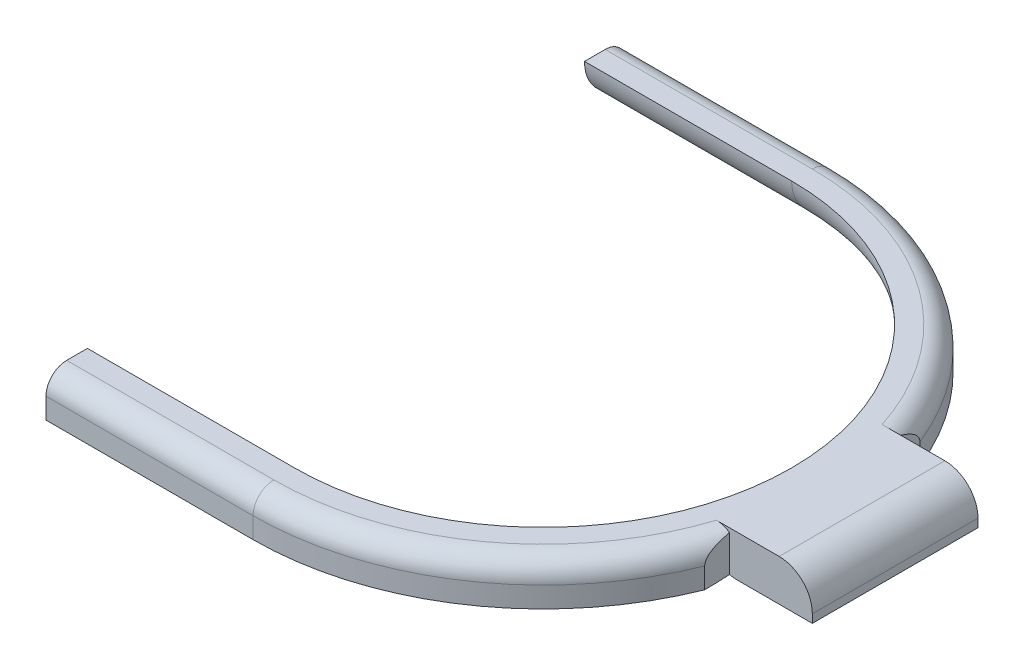
ISO-10303-21;
HEADER;
FILE_DESCRIPTION(('STEP AP214'),'2;1');
FILE_NAME('part.step','',(''),(''),'','','');
FILE_SCHEMA(('AUTOMOTIVE_DESIGN { 1 0 10303 214 1 1 1 1 }'));
ENDSEC;
DATA;
#1=APPLICATION_CONTEXT('core data for automotive mechanical design processes');
#2=APPLICATION_PROTOCOL_DEFINITION('international standard','automotive_design',2000,#1);
#3=PRODUCT_CONTEXT('',#1,'mechanical');
#4=PRODUCT('Part','Part','',(#3));
#5=PRODUCT_RELATED_PRODUCT_CATEGORY('part','',(#4));
#6=PRODUCT_DEFINITION_FORMATION('','',#4);
#7=PRODUCT_DEFINITION_CONTEXT('part definition',#1,'design');
#8=PRODUCT_DEFINITION('design','',#6,#7);
#9=PRODUCT_DEFINITION_SHAPE('','',#8);
#10=(LENGTH_UNIT() NAMED_UNIT(*) SI_UNIT(.MILLI.,.METRE.));
#11=(NAMED_UNIT(*) PLANE_ANGLE_UNIT() SI_UNIT($,.RADIAN.));
#12=(NAMED_UNIT(*) SI_UNIT($,.STERADIAN.) SOLID_ANGLE_UNIT());
#13=UNCERTAINTY_MEASURE_WITH_UNIT(LENGTH_MEASURE(1.E-05),#10,'distance_accuracy_value','');
#14=(GEOMETRIC_REPRESENTATION_CONTEXT(3) GLOBAL_UNCERTAINTY_ASSIGNED_CONTEXT((#13)) GLOBAL_UNIT_ASSIGNED_CONTEXT((#10,
#11,#12)) REPRESENTATION_CONTEXT('',''));
#15=CARTESIAN_POINT('',(0.,0.,0.));
#16=DIRECTION('',(0.,0.,1.));
#17=DIRECTION('',(1.,0.,0.));
#18=AXIS2_PLACEMENT_3D('',#15,#16,#17);
#19=CARTESIAN_POINT('',(16.51,0.,0.));
#20=DIRECTION('',(-1.,0.,0.));
#21=DIRECTION('',(0.,0.,1.));
#22=AXIS2_PLACEMENT_3D('',#19,#20,#21);
#23=PLANE('',#22);
#24=DIRECTION('',(0.,-1.,0.));
#25=VECTOR('',#24,1.);
#26=CARTESIAN_POINT('',(16.51,2.54,-21.8391135768376));
#27=LINE('',#26,#25);
#28=CARTESIAN_POINT('',(16.51,0.,-21.8391135768376));
#29=VERTEX_POINT('',#28);
#30=CARTESIAN_POINT('',(16.51,1.27,-21.8391135768376));
#31=VERTEX_POINT('',#30);
#32=EDGE_CURVE('E324',#29,#31,#27,.F.);
#33=ORIENTED_EDGE('',*,*,#32,.T.);
#34=CARTESIAN_POINT('',(16.51,1.27,-21.8391135768376));
#35=CARTESIAN_POINT('',(16.51,1.29957192329558,-21.8391956993707));
#36=CARTESIAN_POINT('',(16.51,1.32903464210065,-21.8363349804039));
#37=CARTESIAN_POINT('',(16.51,1.38665030756244,-21.8254939918044));
#38=CARTESIAN_POINT('',(16.51,1.4148147761307,-21.817575977312));
#39=CARTESIAN_POINT('',(16.51,1.47586722255378,-21.794996555653));
#40=CARTESIAN_POINT('',(16.51,1.50832522730156,-21.7791932435904));
#41=CARTESIAN_POINT('',(16.51,1.57037414609046,-21.7425488724249));
#42=CARTESIAN_POINT('',(16.51,1.59995005333794,-21.7216832340086));
#43=CARTESIAN_POINT('',(16.51,1.6734640906306,-21.6624048809831));
#44=CARTESIAN_POINT('',(16.51,1.71504003057241,-21.6210957966083));
#45=CARTESIAN_POINT('',(16.51,1.79176285085238,-21.5329752369118));
#46=CARTESIAN_POINT('',(16.51,1.82689530363604,-21.4861517899741));
#47=CARTESIAN_POINT('',(16.51,1.8930377783374,-21.3875264120823));
#48=CARTESIAN_POINT('',(16.51,1.9238784461257,-21.3356126654981));
#49=CARTESIAN_POINT('',(16.51,1.98116795391221,-21.2293874674086));
#50=CARTESIAN_POINT('',(16.51,2.00761187298022,-21.1750734143188));
#51=CARTESIAN_POINT('',(16.51,2.05695635495535,-21.0647063126304));
#52=CARTESIAN_POINT('',(16.51,2.07984742725165,-21.0086490706289));
#53=CARTESIAN_POINT('',(16.51,2.12262000600726,-20.8953918875263));
#54=CARTESIAN_POINT('',(16.51,2.14250064768643,-20.8381916234005));
#55=CARTESIAN_POINT('',(16.51,2.18566855710963,-20.7045945971293));
#56=CARTESIAN_POINT('',(16.51,2.20801801972574,-20.6278976026139));
#57=CARTESIAN_POINT('',(16.51,2.24889350988818,-20.4742166986682));
#58=CARTESIAN_POINT('',(16.51,2.26745184212038,-20.3972414403506));
#59=CARTESIAN_POINT('',(16.51,2.28459665484587,-20.32));
#60=B_SPLINE_CURVE_WITH_KNOTS('',3,(#34,#35,#36,#37,#38,#39,#40,#41,#42,#43,#44,#45,#46,#47,#48,
#49,#50,#51,#52,#53,#54,#55,#56,#57,#58,#59),.UNSPECIFIED.,.F.,.F.,(4,2,2,2,2,2,2,2,2,2,2,2,4),
(0.,0.0884016339942781,0.175735486757691,0.283434021950953,0.391666319888252,0.566503784031838,
0.741728069174911,0.92259965587675,1.10367233455243,1.28522067745047,1.46682107362519,
1.70638026977833,1.9438041429385),.UNSPECIFIED.);
#61=CARTESIAN_POINT('',(16.51,2.28459665484588,-20.32));
#62=VERTEX_POINT('',#61);
#63=EDGE_CURVE('E247',#31,#62,#60,.T.);
#64=ORIENTED_EDGE('',*,*,#63,.T.);
#65=DIRECTION('',(0.,1.,0.));
#66=VECTOR('',#65,1.);
#67=CARTESIAN_POINT('',(16.51,0.,-20.32));
#68=LINE('',#67,#66);
#69=CARTESIAN_POINT('',(16.51,0.0509379398851836,-20.32));
#70=VERTEX_POINT('',#69);
#71=EDGE_CURVE('E182',#70,#62,#68,.T.);
#72=ORIENTED_EDGE('',*,*,#71,.F.);
#73=CARTESIAN_POINT('',(16.51,0.0509379398851836,-20.32));
#74=CARTESIAN_POINT('',(16.51,0.0433773737680133,-20.4464635100683));
#75=CARTESIAN_POINT('',(16.51,0.0364205547009695,-20.5729670385125));
#76=CARTESIAN_POINT('',(16.51,0.0240503931053028,-20.8260206146187));
#77=CARTESIAN_POINT('',(16.51,0.0186367071416438,-20.9525706456437));
#78=CARTESIAN_POINT('',(16.51,0.00968477527614573,-21.2057500320715));
#79=CARTESIAN_POINT('',(16.51,0.00614667731656588,-21.3323793929432));
#80=CARTESIAN_POINT('',(16.51,0.00130588216209494,-21.5857080243475));
#81=CARTESIAN_POINT('',(16.51,3.68359901411543E-06,-21.7124073041727));
#82=CARTESIAN_POINT('',(16.51,0.,-21.8391135768376));
#83=B_SPLINE_CURVE_WITH_KNOTS('',3,(#73,#74,#75,#76,#77,#78,#79,#80,#81,#82),.UNSPECIFIED.,.F.,
.F.,(4,2,2,2,4),(0.,0.380072205109549,0.760059756335925,1.14007727568707,1.52017953240358),.UNSPECIFIED.);
#84=EDGE_CURVE('E200',#70,#29,#83,.T.);
#85=ORIENTED_EDGE('',*,*,#84,.T.);
#86=EDGE_LOOP('',(#33,#64,#72,#85));
#87=FACE_BOUND('',#86,.T.);
#88=ADVANCED_FACE('F33',(#87),#23,.F.);
#89=DIRECTION('',(0.,-1.,0.));
#90=VECTOR('',#89,1.);
#91=CARTESIAN_POINT('',(16.51,0.,-10.16));
#92=LINE('',#91,#90);
#93=CARTESIAN_POINT('',(16.51,2.28459665484588,-10.16));
#94=VERTEX_POINT('',#93);
#95=CARTESIAN_POINT('',(16.51,0.0509379398851836,-10.16));
#96=VERTEX_POINT('',#95);
#97=EDGE_CURVE('E186',#94,#96,#92,.T.);
#98=ORIENTED_EDGE('',*,*,#97,.F.);
#99=CARTESIAN_POINT('',(16.51,2.28459665484588,-10.16));
#100=CARTESIAN_POINT('',(16.51,2.26660719846655,-10.0789821772811));
#101=CARTESIAN_POINT('',(16.51,2.24707025721331,-9.99825408169174));
#102=CARTESIAN_POINT('',(16.51,2.20391715925547,-9.83747964380927));
#103=CARTESIAN_POINT('',(16.51,2.18028147710955,-9.75743858280148));
#104=CARTESIAN_POINT('',(16.51,2.12779802247256,-9.59801014376653));
#105=CARTESIAN_POINT('',(16.51,2.09889208131413,-9.51864160065115));
#106=CARTESIAN_POINT('',(16.51,2.03472968285877,-9.36262990430201));
#107=CARTESIAN_POINT('',(16.51,1.9994872958267,-9.28598115431515));
#108=CARTESIAN_POINT('',(16.51,1.93573378047491,-9.16570434447224));
#109=CARTESIAN_POINT('',(16.51,1.90983535881678,-9.12069968544181));
#110=CARTESIAN_POINT('',(16.51,1.85413233618648,-9.03310021345614));
#111=CARTESIAN_POINT('',(16.51,1.82432601653496,-8.99050647268378));
#112=CARTESIAN_POINT('',(16.51,1.75963352899151,-8.90854199204505));
#113=CARTESIAN_POINT('',(16.51,1.72469541483683,-8.86921155333711));
#114=CARTESIAN_POINT('',(16.51,1.64901143803038,-8.79654540444889));
#115=CARTESIAN_POINT('',(16.51,1.60828455679736,-8.76319087688441));
#116=CARTESIAN_POINT('',(16.51,1.53869952734225,-8.7179640249935));
#117=CARTESIAN_POINT('',(16.51,1.51191776025871,-8.70291760399087));
#118=CARTESIAN_POINT('',(16.51,1.45638304554998,-8.67716555632066));
#119=CARTESIAN_POINT('',(16.51,1.42763655899632,-8.66644643301098));
#120=CARTESIAN_POINT('',(16.51,1.37736548918517,-8.65267883909492));
#121=CARTESIAN_POINT('',(16.51,1.35620319159293,-8.64830160266421));
#122=CARTESIAN_POINT('',(16.51,1.3133720501847,-8.64238443866641));
#123=CARTESIAN_POINT('',(16.51,1.29170107931136,-8.64086005174927));
#124=CARTESIAN_POINT('',(16.51,1.27,-8.64088642316235));
#125=B_SPLINE_CURVE_WITH_KNOTS('',3,(#99,#100,#101,#102,#103,#104,#105,#106,#107,#108,#109,#110,
#111,#112,#113,#114,#115,#116,#117,#118,#119,#120,#121,#122,#123,#124),.UNSPECIFIED.,.F.,.F.,(4,
2,2,2,2,2,2,2,2,2,2,2,4),(0.,0.249038643903638,0.499297985054032,0.752508076254614,
1.00516269918887,1.16078790119703,1.31648177764216,1.47387683724518,1.63076721867043,
1.7226360306251,1.81421605215406,1.87886403888139,1.94386317623388),.UNSPECIFIED.);
#126=CARTESIAN_POINT('',(16.51,1.27,-8.64088642316235));
#127=VERTEX_POINT('',#126);
#128=EDGE_CURVE('E270',#94,#127,#125,.T.);
#129=ORIENTED_EDGE('',*,*,#128,.T.);
#130=DIRECTION('',(0.,-1.,0.));
#131=VECTOR('',#130,1.);
#132=CARTESIAN_POINT('',(16.51,2.54,-8.64088642316235));
#133=LINE('',#132,#131);
#134=CARTESIAN_POINT('',(16.51,0.,-8.64088642316235));
#135=VERTEX_POINT('',#134);
#136=EDGE_CURVE('E323',#127,#135,#133,.T.);
#137=ORIENTED_EDGE('',*,*,#136,.T.);
#138=CARTESIAN_POINT('',(16.51,0.,-8.64088642316235));
#139=CARTESIAN_POINT('',(16.51,3.68359901443557E-06,-8.76759269582731));
#140=CARTESIAN_POINT('',(16.51,0.00130588216209523,-8.89429197565246));
#141=CARTESIAN_POINT('',(16.51,0.00614667731656587,-9.14762060705681));
#142=CARTESIAN_POINT('',(16.51,0.00968477527614546,-9.27424996792849));
#143=CARTESIAN_POINT('',(16.51,0.0186367071416434,-9.52742935435629));
#144=CARTESIAN_POINT('',(16.51,0.0240503931053024,-9.65397938538129));
#145=CARTESIAN_POINT('',(16.51,0.0364205547009694,-9.90703296148751));
#146=CARTESIAN_POINT('',(16.51,0.0433773737680132,-10.0335364899317));
#147=CARTESIAN_POINT('',(16.51,0.0509379398851837,-10.16));
#148=B_SPLINE_CURVE_WITH_KNOTS('',3,(#138,#139,#140,#141,#142,#143,#144,#145,#146,#147),
.UNSPECIFIED.,.F.,.F.,(4,2,2,2,4),(0.,0.380102256716508,0.760119776067651,1.14010732729403,
1.52017953240358),.UNSPECIFIED.);
#149=EDGE_CURVE('E273',#135,#96,#148,.T.);
#150=ORIENTED_EDGE('',*,*,#149,.T.);
#151=EDGE_LOOP('',(#98,#129,#137,#150));
#152=FACE_BOUND('',#151,.T.);
#153=ADVANCED_FACE('F269',(#152),#23,.F.);
#154=CARTESIAN_POINT('',(0.,2.54,-15.24));
#155=DIRECTION('',(0.,-1.,0.));
#156=DIRECTION('',(0.,0.,-1.));
#157=AXIS2_PLACEMENT_3D('',#154,#155,#156);
#158=CYLINDRICAL_SURFACE('',#157,17.78);
#159=DIRECTION('',(0.,-1.,0.));
#160=VECTOR('',#159,1.);
#161=CARTESIAN_POINT('',(2.00491150009512E-13,2.54,-33.02));
#162=LINE('',#161,#160);
#163=CARTESIAN_POINT('',(2.00491150009512E-13,1.27,-33.02));
#164=VERTEX_POINT('',#163);
#165=CARTESIAN_POINT('',(2.00491150009512E-13,0.,-33.02));
#166=VERTEX_POINT('',#165);
#167=EDGE_CURVE('E353',#164,#166,#162,.T.);
#168=ORIENTED_EDGE('',*,*,#167,.F.);
#169=CARTESIAN_POINT('',(0.,1.27,-15.24));
#170=DIRECTION('',(0.,1.,0.));
#171=DIRECTION('',(0.,0.,1.));
#172=AXIS2_PLACEMENT_3D('',#169,#170,#171);
#173=CIRCLE('',#172,17.78);
#174=EDGE_CURVE('E254',#164,#31,#173,.F.);
#175=ORIENTED_EDGE('',*,*,#174,.T.);
#176=ORIENTED_EDGE('',*,*,#32,.F.);
#177=CARTESIAN_POINT('',(0.,0.,-15.24));
#178=DIRECTION('',(0.,1.,0.));
#179=DIRECTION('',(1.,0.,0.));
#180=AXIS2_PLACEMENT_3D('',#177,#178,#179);
#181=CIRCLE('',#180,17.78);
#182=EDGE_CURVE('E348',#166,#29,#181,.F.);
#183=ORIENTED_EDGE('',*,*,#182,.F.);
#184=EDGE_LOOP('',(#168,#175,#176,#183));
#185=FACE_BOUND('',#184,.T.);
#186=ADVANCED_FACE('F403',(#185),#158,.T.);
#187=CARTESIAN_POINT('',(-12.6999999999997,2.54,2.54));
#188=DIRECTION('',(-1.,0.,0.));
#189=DIRECTION('',(0.,0.,1.));
#190=AXIS2_PLACEMENT_3D('',#187,#188,#189);
#191=PLANE('',#190);
#192=DIRECTION('',(0.,-1.,0.));
#193=VECTOR('',#192,1.);
#194=CARTESIAN_POINT('',(-12.6999999999997,2.54,2.54));
#195=LINE('',#194,#193);
#196=CARTESIAN_POINT('',(-12.6999999999997,1.27,2.54));
#197=VERTEX_POINT('',#196);
#198=CARTESIAN_POINT('',(-12.6999999999997,0.,2.54));
#199=VERTEX_POINT('',#198);
#200=EDGE_CURVE('E357',#197,#199,#195,.T.);
#201=ORIENTED_EDGE('',*,*,#200,.F.);
#202=CARTESIAN_POINT('',(-12.6999999999997,1.27,1.27));
#203=DIRECTION('',(-1.,0.,0.));
#204=DIRECTION('',(0.,0.,1.));
#205=AXIS2_PLACEMENT_3D('',#202,#203,#204);
#206=CIRCLE('',#205,1.27);
#207=CARTESIAN_POINT('',(-12.6999999999997,2.54,1.27));
#208=VERTEX_POINT('',#207);
#209=EDGE_CURVE('E256',#197,#208,#206,.T.);
#210=ORIENTED_EDGE('',*,*,#209,.T.);
#211=DIRECTION('',(0.,0.,-1.));
#212=VECTOR('',#211,1.);
#213=CARTESIAN_POINT('',(-12.6999999999997,2.54,2.54));
#214=LINE('',#213,#212);
#215=CARTESIAN_POINT('',(-12.6999999999997,2.54,0.));
#216=VERTEX_POINT('',#215);
#217=EDGE_CURVE('E333',#208,#216,#214,.T.);
#218=ORIENTED_EDGE('',*,*,#217,.T.);
#219=CARTESIAN_POINT('',(-12.6999999999997,2.54,2.54));
#220=DIRECTION('',(-1.,0.,0.));
#221=DIRECTION('',(0.,0.,1.));
#222=AXIS2_PLACEMENT_3D('',#219,#220,#221);
#223=CIRCLE('',#222,2.54);
#224=EDGE_CURVE('E364',#216,#199,#223,.T.);
#225=ORIENTED_EDGE('',*,*,#224,.T.);
#226=EDGE_LOOP('',(#201,#210,#218,#225));
#227=FACE_BOUND('',#226,.T.);
#228=ADVANCED_FACE('F372',(#227),#191,.T.);
#229=CARTESIAN_POINT('',(0.,2.54,2.54));
#230=DIRECTION('',(0.,0.,1.));
#231=DIRECTION('',(1.,0.,0.));
#232=AXIS2_PLACEMENT_3D('',#229,#230,#231);
#233=PLANE('',#232);
#234=DIRECTION('',(0.,-1.,0.));
#235=VECTOR('',#234,1.);
#236=CARTESIAN_POINT('',(0.,2.54,2.54));
#237=LINE('',#236,#235);
#238=CARTESIAN_POINT('',(0.,1.27,2.54));
#239=VERTEX_POINT('',#238);
#240=CARTESIAN_POINT('',(0.,0.,2.54));
#241=VERTEX_POINT('',#240);
#242=EDGE_CURVE('E355',#239,#241,#237,.T.);
#243=ORIENTED_EDGE('',*,*,#242,.F.);
#244=DIRECTION('',(-1.,0.,0.));
#245=VECTOR('',#244,1.);
#246=CARTESIAN_POINT('',(0.,1.27,2.54));
#247=LINE('',#246,#245);
#248=EDGE_CURVE('E253',#239,#197,#247,.T.);
#249=ORIENTED_EDGE('',*,*,#248,.T.);
#250=ORIENTED_EDGE('',*,*,#200,.T.);
#251=DIRECTION('',(1.,0.,0.));
#252=VECTOR('',#251,1.);
#253=CARTESIAN_POINT('',(0.,0.,2.54));
#254=LINE('',#253,#252);
#255=EDGE_CURVE('E327',#241,#199,#254,.F.);
#256=ORIENTED_EDGE('',*,*,#255,.F.);
#257=EDGE_LOOP('',(#243,#249,#250,#256));
#258=FACE_BOUND('',#257,.T.);
#259=ADVANCED_FACE('F379',(#258),#233,.T.);
#260=ORIENTED_EDGE('',*,*,#136,.F.);
#261=CARTESIAN_POINT('',(0.,1.27,-15.24));
#262=DIRECTION('',(0.,1.,0.));
#263=DIRECTION('',(0.,0.,1.));
#264=AXIS2_PLACEMENT_3D('',#261,#262,#263);
#265=CIRCLE('',#264,17.78);
#266=EDGE_CURVE('E277',#127,#239,#265,.F.);
#267=ORIENTED_EDGE('',*,*,#266,.T.);
#268=ORIENTED_EDGE('',*,*,#242,.T.);
#269=EDGE_CURVE('E347',#135,#241,#181,.F.);
#270=ORIENTED_EDGE('',*,*,#269,.F.);
#271=EDGE_LOOP('',(#260,#267,#268,#270));
#272=FACE_BOUND('',#271,.T.);
#273=ADVANCED_FACE('F381',(#272),#158,.T.);
#274=CARTESIAN_POINT('',(-12.6999999999998,2.54,-33.02));
#275=DIRECTION('',(0.,0.,-1.));
#276=DIRECTION('',(-1.,0.,0.));
#277=AXIS2_PLACEMENT_3D('',#274,#275,#276);
#278=PLANE('',#277);
#279=DIRECTION('',(0.,-1.,0.));
#280=VECTOR('',#279,1.);
#281=CARTESIAN_POINT('',(-12.6999999999998,2.54,-33.02));
#282=LINE('',#281,#280);
#283=CARTESIAN_POINT('',(-12.6999999999998,1.27,-33.02));
#284=VERTEX_POINT('',#283);
#285=CARTESIAN_POINT('',(-12.6999999999998,0.,-33.02));
#286=VERTEX_POINT('',#285);
#287=EDGE_CURVE('E344',#284,#286,#282,.T.);
#288=ORIENTED_EDGE('',*,*,#287,.F.);
#289=DIRECTION('',(1.,0.,0.));
#290=VECTOR('',#289,1.);
#291=CARTESIAN_POINT('',(-12.6999999999998,1.27,-33.02));
#292=LINE('',#291,#290);
#293=EDGE_CURVE('E293',#284,#164,#292,.T.);
#294=ORIENTED_EDGE('',*,*,#293,.T.);
#295=ORIENTED_EDGE('',*,*,#167,.T.);
#296=DIRECTION('',(1.,0.,0.));
#297=VECTOR('',#296,1.);
#298=CARTESIAN_POINT('',(-12.6999999999998,0.,-33.02));
#299=LINE('',#298,#297);
#300=EDGE_CURVE('E334',#286,#166,#299,.T.);
#301=ORIENTED_EDGE('',*,*,#300,.F.);
#302=EDGE_LOOP('',(#288,#294,#295,#301));
#303=FACE_BOUND('',#302,.T.);
#304=ADVANCED_FACE('F417',(#303),#278,.T.);
#305=CARTESIAN_POINT('',(-12.6999999999998,2.54,-30.48));
#306=DIRECTION('',(-1.,0.,0.));
#307=DIRECTION('',(0.,0.,1.));
#308=AXIS2_PLACEMENT_3D('',#305,#306,#307);
#309=PLANE('',#308);
#310=DIRECTION('',(0.,0.,-1.));
#311=VECTOR('',#310,1.);
#312=CARTESIAN_POINT('',(-12.6999999999998,2.54,-30.48));
#313=LINE('',#312,#311);
#314=CARTESIAN_POINT('',(-12.6999999999998,2.54,-30.48));
#315=VERTEX_POINT('',#314);
#316=CARTESIAN_POINT('',(-12.6999999999998,2.54,-31.75));
#317=VERTEX_POINT('',#316);
#318=EDGE_CURVE('E336',#315,#317,#313,.T.);
#319=ORIENTED_EDGE('',*,*,#318,.T.);
#320=CARTESIAN_POINT('',(-12.6999999999998,1.27,-31.75));
#321=DIRECTION('',(-1.,0.,0.));
#322=DIRECTION('',(0.,0.,1.));
#323=AXIS2_PLACEMENT_3D('',#320,#321,#322);
#324=CIRCLE('',#323,1.27);
#325=EDGE_CURVE('E278',#317,#284,#324,.T.);
#326=ORIENTED_EDGE('',*,*,#325,.T.);
#327=ORIENTED_EDGE('',*,*,#287,.T.);
#328=CARTESIAN_POINT('',(-12.6999999999998,2.54,-33.02));
#329=DIRECTION('',(-1.,0.,0.));
#330=DIRECTION('',(0.,0.,1.));
#331=AXIS2_PLACEMENT_3D('',#328,#329,#330);
#332=CIRCLE('',#331,2.54);
#333=EDGE_CURVE('E362',#286,#315,#332,.T.);
#334=ORIENTED_EDGE('',*,*,#333,.T.);
#335=EDGE_LOOP('',(#319,#326,#327,#334));
#336=FACE_BOUND('',#335,.T.);
#337=ADVANCED_FACE('F422',(#336),#309,.T.);
#338=CARTESIAN_POINT('',(0.,2.54,-15.24));
#339=DIRECTION('',(0.,1.,0.));
#340=DIRECTION('',(1.,0.,0.));
#341=AXIS2_PLACEMENT_3D('',#338,#339,#340);
#342=PLANE('',#341);
#343=DIRECTION('',(-1.,0.,0.));
#344=VECTOR('',#343,1.);
#345=CARTESIAN_POINT('',(21.59,2.54,-10.16));
#346=LINE('',#345,#344);
#347=CARTESIAN_POINT('',(19.558,2.54,-10.16));
#348=VERTEX_POINT('',#347);
#349=CARTESIAN_POINT('',(15.7090324336034,2.54,-10.16));
#350=VERTEX_POINT('',#349);
#351=EDGE_CURVE('E167',#348,#350,#346,.T.);
#352=ORIENTED_EDGE('',*,*,#351,.F.);
#353=DIRECTION('',(0.,0.,1.));
#354=VECTOR('',#353,1.);
#355=CARTESIAN_POINT('',(19.558,2.54,-15.24));
#356=LINE('',#355,#354);
#357=CARTESIAN_POINT('',(19.558,2.54,-20.32));
#358=VERTEX_POINT('',#357);
#359=EDGE_CURVE('E41',#348,#358,#356,.F.);
#360=ORIENTED_EDGE('',*,*,#359,.T.);
#361=DIRECTION('',(-1.,0.,0.));
#362=VECTOR('',#361,1.);
#363=CARTESIAN_POINT('',(21.59,2.54,-20.32));
#364=LINE('',#363,#362);
#365=CARTESIAN_POINT('',(15.7090324336034,2.54,-20.32));
#366=VERTEX_POINT('',#365);
#367=EDGE_CURVE('E315',#358,#366,#364,.T.);
#368=ORIENTED_EDGE('',*,*,#367,.T.);
#369=CARTESIAN_POINT('',(0.,2.54,-15.24));
#370=DIRECTION('',(0.,1.,0.));
#371=DIRECTION('',(0.,0.,1.));
#372=AXIS2_PLACEMENT_3D('',#369,#370,#371);
#373=CIRCLE('',#372,16.51);
#374=CARTESIAN_POINT('',(2.00491150009512E-13,2.54,-31.75));
#375=VERTEX_POINT('',#374);
#376=EDGE_CURVE('E287',#366,#375,#373,.T.);
#377=ORIENTED_EDGE('',*,*,#376,.T.);
#378=DIRECTION('',(1.,0.,0.));
#379=VECTOR('',#378,1.);
#380=CARTESIAN_POINT('',(0.,2.54,-31.75));
#381=LINE('',#380,#379);
#382=EDGE_CURVE('E285',#375,#317,#381,.F.);
#383=ORIENTED_EDGE('',*,*,#382,.T.);
#384=ORIENTED_EDGE('',*,*,#318,.F.);
#385=DIRECTION('',(1.,0.,0.));
#386=VECTOR('',#385,1.);
#387=CARTESIAN_POINT('',(-12.6999999999998,2.54,-30.48));
#388=LINE('',#387,#386);
#389=CARTESIAN_POINT('',(1.85615411929518E-13,2.54,-30.48));
#390=VERTEX_POINT('',#389);
#391=EDGE_CURVE('E339',#315,#390,#388,.T.);
#392=ORIENTED_EDGE('',*,*,#391,.T.);
#393=CARTESIAN_POINT('',(0.,2.54,-15.24));
#394=DIRECTION('',(0.,-1.,0.));
#395=DIRECTION('',(0.,0.,-1.));
#396=AXIS2_PLACEMENT_3D('',#393,#394,#395);
#397=CIRCLE('',#396,15.24);
#398=CARTESIAN_POINT('',(0.,2.54,0.));
#399=VERTEX_POINT('',#398);
#400=EDGE_CURVE('E342',#390,#399,#397,.T.);
#401=ORIENTED_EDGE('',*,*,#400,.T.);
#402=DIRECTION('',(-1.,0.,0.));
#403=VECTOR('',#402,1.);
#404=CARTESIAN_POINT('',(0.,2.54,0.));
#405=LINE('',#404,#403);
#406=EDGE_CURVE('E330',#399,#216,#405,.T.);
#407=ORIENTED_EDGE('',*,*,#406,.T.);
#408=ORIENTED_EDGE('',*,*,#217,.F.);
#409=DIRECTION('',(-1.,0.,0.));
#410=VECTOR('',#409,1.);
#411=CARTESIAN_POINT('',(0.,2.54,1.27));
#412=LINE('',#411,#410);
#413=CARTESIAN_POINT('',(0.,2.54,1.27));
#414=VERTEX_POINT('',#413);
#415=EDGE_CURVE('E291',#208,#414,#412,.F.);
#416=ORIENTED_EDGE('',*,*,#415,.T.);
#417=CARTESIAN_POINT('',(0.,2.54,-15.24));
#418=DIRECTION('',(0.,1.,0.));
#419=DIRECTION('',(0.,0.,1.));
#420=AXIS2_PLACEMENT_3D('',#417,#418,#419);
#421=CIRCLE('',#420,16.51);
#422=EDGE_CURVE('E289',#414,#350,#421,.T.);
#423=ORIENTED_EDGE('',*,*,#422,.T.);
#424=EDGE_LOOP('',(#352,#360,#368,#377,#383,#384,#392,#401,#407,#408,#416,#423));
#425=FACE_BOUND('',#424,.T.);
#426=ADVANCED_FACE('F435',(#425),#342,.T.);
#427=CARTESIAN_POINT('',(0.,0.,-15.24));
#428=DIRECTION('',(0.,1.,0.));
#429=DIRECTION('',(1.,0.,0.));
#430=AXIS2_PLACEMENT_3D('',#427,#428,#429);
#431=PLANE('',#430);
#432=DIRECTION('',(-1.,0.,0.));
#433=VECTOR('',#432,1.);
#434=CARTESIAN_POINT('',(21.59,0.,-10.16));
#435=LINE('',#434,#433);
#436=CARTESIAN_POINT('',(21.59,0.,-10.16));
#437=VERTEX_POINT('',#436);
#438=CARTESIAN_POINT('',(17.0388379885485,0.,-10.16));
#439=VERTEX_POINT('',#438);
#440=EDGE_CURVE('E161',#437,#439,#435,.T.);
#441=ORIENTED_EDGE('',*,*,#440,.T.);
#442=CARTESIAN_POINT('',(0.,0.,-15.24));
#443=DIRECTION('',(0.,1.,0.));
#444=DIRECTION('',(0.,0.,1.));
#445=AXIS2_PLACEMENT_3D('',#442,#443,#444);
#446=CIRCLE('',#445,17.78);
#447=CARTESIAN_POINT('',(17.0388379885485,0.,-20.32));
#448=VERTEX_POINT('',#447);
#449=EDGE_CURVE('E358',#439,#448,#446,.T.);
#450=ORIENTED_EDGE('',*,*,#449,.T.);
#451=DIRECTION('',(-1.,0.,0.));
#452=VECTOR('',#451,1.);
#453=CARTESIAN_POINT('',(21.59,0.,-20.32));
#454=LINE('',#453,#452);
#455=CARTESIAN_POINT('',(21.59,0.,-20.32));
#456=VERTEX_POINT('',#455);
#457=EDGE_CURVE('E168',#456,#448,#454,.T.);
#458=ORIENTED_EDGE('',*,*,#457,.F.);
#459=DIRECTION('',(0.,0.,-1.));
#460=VECTOR('',#459,1.);
#461=CARTESIAN_POINT('',(21.59,0.,-20.32));
#462=LINE('',#461,#460);
#463=EDGE_CURVE('E154',#437,#456,#462,.T.);
#464=ORIENTED_EDGE('',*,*,#463,.F.);
#465=EDGE_LOOP('',(#441,#450,#458,#464));
#466=FACE_BOUND('',#465,.T.);
#467=ADVANCED_FACE('F170',(#466),#431,.F.);
#468=CARTESIAN_POINT('',(21.59,0.,-20.32));
#469=DIRECTION('',(0.,0.,1.));
#470=DIRECTION('',(1.,0.,0.));
#471=AXIS2_PLACEMENT_3D('',#468,#469,#470);
#472=PLANE('',#471);
#473=ORIENTED_EDGE('',*,*,#367,.F.);
#474=CARTESIAN_POINT('',(19.558,0.508,-20.32));
#475=DIRECTION('',(0.,0.,1.));
#476=DIRECTION('',(1.,0.,0.));
#477=AXIS2_PLACEMENT_3D('',#474,#475,#476);
#478=CIRCLE('',#477,2.032);
#479=CARTESIAN_POINT('',(21.59,0.508,-20.32));
#480=VERTEX_POINT('',#479);
#481=EDGE_CURVE('E11',#358,#480,#478,.F.);
#482=ORIENTED_EDGE('',*,*,#481,.T.);
#483=DIRECTION('',(0.,1.,0.));
#484=VECTOR('',#483,1.);
#485=CARTESIAN_POINT('',(21.59,0.,-20.32));
#486=LINE('',#485,#484);
#487=EDGE_CURVE('E158',#456,#480,#486,.T.);
#488=ORIENTED_EDGE('',*,*,#487,.F.);
#489=ORIENTED_EDGE('',*,*,#457,.T.);
#490=CARTESIAN_POINT('',(17.0388379885485,0.,-20.32));
#491=CARTESIAN_POINT('',(16.9498827669766,2.53908682923645E-05,-20.32));
#492=CARTESIAN_POINT('',(16.8613351897019,0.00428294066348747,-20.32));
#493=CARTESIAN_POINT('',(16.6850558651941,0.0212623059550475,-20.32));
#494=CARTESIAN_POINT('',(16.5973241129526,0.0339840694549136,-20.32));
#495=CARTESIAN_POINT('',(16.51,0.0509379398851837,-20.32));
#496=B_SPLINE_CURVE_WITH_KNOTS('',3,(#490,#491,#492,#493,#494,#495),.UNSPECIFIED.,.F.,.F.,(4,2,
4),(0.,0.265949622190603,0.531897610641556),.UNSPECIFIED.);
#497=EDGE_CURVE('E194',#448,#70,#496,.T.);
#498=ORIENTED_EDGE('',*,*,#497,.T.);
#499=ORIENTED_EDGE('',*,*,#71,.T.);
#500=CARTESIAN_POINT('',(16.51,2.28459665484588,-20.32));
#501=CARTESIAN_POINT('',(16.4785153808442,2.30725189547256,-20.32));
#502=CARTESIAN_POINT('',(16.4460524067965,2.32850808528686,-20.32));
#503=CARTESIAN_POINT('',(16.3794098147913,2.36812007795567,-20.32));
#504=CARTESIAN_POINT('',(16.3452304990841,2.38647638913905,-20.32));
#505=CARTESIAN_POINT('',(16.242286286552,2.4361721321654,-20.32));
#506=CARTESIAN_POINT('',(16.1714432008699,2.46332855450743,-20.32));
#507=CARTESIAN_POINT('',(16.0363595416472,2.50272677451277,-20.32));
#508=CARTESIAN_POINT('',(15.9725562122761,2.51650919649257,-20.32));
#509=CARTESIAN_POINT('',(15.8422069853459,2.53525575590893,-20.32));
#510=CARTESIAN_POINT('',(15.7756316632161,2.54001586594468,-20.32));
#511=CARTESIAN_POINT('',(15.7090324336034,2.54,-20.32));
#512=B_SPLINE_CURVE_WITH_KNOTS('',3,(#500,#501,#502,#503,#504,#505,#506,#507,#508,#509,#510,
#511),.UNSPECIFIED.,.F.,.F.,(4,2,2,2,2,4),(0.,0.116283866490581,0.232547326542617,
0.458997197075374,0.654210014696065,0.853786958437172),.UNSPECIFIED.);
#513=EDGE_CURVE('E220',#62,#366,#512,.T.);
#514=ORIENTED_EDGE('',*,*,#513,.T.);
#515=EDGE_LOOP('',(#473,#482,#488,#489,#498,#499,#514));
#516=FACE_BOUND('',#515,.T.);
#517=ADVANCED_FACE('F210',(#516),#472,.F.);
#518=CARTESIAN_POINT('',(21.59,0.,-10.16));
#519=DIRECTION('',(0.,0.,-1.));
#520=DIRECTION('',(-1.,0.,0.));
#521=AXIS2_PLACEMENT_3D('',#518,#519,#520);
#522=PLANE('',#521);
#523=DIRECTION('',(0.,-1.,0.));
#524=VECTOR('',#523,1.);
#525=CARTESIAN_POINT('',(21.59,0.,-10.16));
#526=LINE('',#525,#524);
#527=CARTESIAN_POINT('',(21.59,0.508,-10.16));
#528=VERTEX_POINT('',#527);
#529=EDGE_CURVE('E149',#528,#437,#526,.T.);
#530=ORIENTED_EDGE('',*,*,#529,.F.);
#531=CARTESIAN_POINT('',(19.558,0.508,-10.16));
#532=DIRECTION('',(0.,0.,-1.));
#533=DIRECTION('',(-1.,0.,0.));
#534=AXIS2_PLACEMENT_3D('',#531,#532,#533);
#535=CIRCLE('',#534,2.032);
#536=EDGE_CURVE('E55',#528,#348,#535,.F.);
#537=ORIENTED_EDGE('',*,*,#536,.T.);
#538=ORIENTED_EDGE('',*,*,#351,.T.);
#539=CARTESIAN_POINT('',(15.7090324336034,2.54,-10.16));
#540=CARTESIAN_POINT('',(15.7483637003078,2.53999856463062,-10.16));
#541=CARTESIAN_POINT('',(15.7876755752593,2.53834486206661,-10.16));
#542=CARTESIAN_POINT('',(15.8660271747491,2.53173342810787,-10.16));
#543=CARTESIAN_POINT('',(15.9050668503619,2.52677511745898,-10.16));
#544=CARTESIAN_POINT('',(16.0193371537353,2.50729765141502,-10.16));
#545=CARTESIAN_POINT('',(16.0938432691345,2.48817109636719,-10.16));
#546=CARTESIAN_POINT('',(16.2267180940427,2.44189164109669,-10.16));
#547=CARTESIAN_POINT('',(16.285733461623,2.41656250332127,-10.16));
#548=CARTESIAN_POINT('',(16.4008327572776,2.35714971282792,-10.16));
#549=CARTESIAN_POINT('',(16.4568232668087,2.32288521826481,-10.16));
#550=CARTESIAN_POINT('',(16.51,2.28459665484588,-10.16));
#551=B_SPLINE_CURVE_WITH_KNOTS('',3,(#539,#540,#541,#542,#543,#544,#545,#546,#547,#548,#549,
#550),.UNSPECIFIED.,.F.,.F.,(4,2,2,2,2,4),(0.,0.117919892157617,0.235860459553085,
0.465447649748594,0.65749477561589,0.853779555202775),.UNSPECIFIED.);
#552=EDGE_CURVE('E228',#350,#94,#551,.T.);
#553=ORIENTED_EDGE('',*,*,#552,.T.);
#554=ORIENTED_EDGE('',*,*,#97,.T.);
#555=CARTESIAN_POINT('',(16.51,0.0509379398851836,-10.16));
#556=CARTESIAN_POINT('',(16.5973241129526,0.0339840694549138,-10.16));
#557=CARTESIAN_POINT('',(16.6850558651941,0.0212623059550478,-10.16));
#558=CARTESIAN_POINT('',(16.8613351897019,0.00428294066348774,-10.16));
#559=CARTESIAN_POINT('',(16.9498827669766,2.53908682924782E-05,-10.16));
#560=CARTESIAN_POINT('',(17.0388379885485,0.,-10.16));
#561=B_SPLINE_CURVE_WITH_KNOTS('',3,(#555,#556,#557,#558,#559,#560),.UNSPECIFIED.,.F.,.F.,(4,2,
4),(0.,0.265947988450953,0.531897610641556),.UNSPECIFIED.);
#562=EDGE_CURVE('E164',#96,#439,#561,.T.);
#563=ORIENTED_EDGE('',*,*,#562,.T.);
#564=ORIENTED_EDGE('',*,*,#440,.F.);
#565=EDGE_LOOP('',(#530,#537,#538,#553,#554,#563,#564));
#566=FACE_BOUND('',#565,.T.);
#567=ADVANCED_FACE('F162',(#566),#522,.F.);
#568=CARTESIAN_POINT('',(21.59,0.,0.));
#569=DIRECTION('',(1.,0.,0.));
#570=DIRECTION('',(0.,0.,-1.));
#571=AXIS2_PLACEMENT_3D('',#568,#569,#570);
#572=PLANE('',#571);
#573=ORIENTED_EDGE('',*,*,#487,.T.);
#574=DIRECTION('',(0.,0.,1.));
#575=VECTOR('',#574,1.);
#576=CARTESIAN_POINT('',(21.59,0.508,0.));
#577=LINE('',#576,#575);
#578=EDGE_CURVE('E157',#480,#528,#577,.T.);
#579=ORIENTED_EDGE('',*,*,#578,.T.);
#580=ORIENTED_EDGE('',*,*,#529,.T.);
#581=ORIENTED_EDGE('',*,*,#463,.T.);
#582=EDGE_LOOP('',(#573,#579,#580,#581));
#583=FACE_BOUND('',#582,.T.);
#584=ADVANCED_FACE('F152',(#583),#572,.T.);
#585=CARTESIAN_POINT('',(0.,2.54,2.54));
#586=DIRECTION('',(-1.,0.,0.));
#587=DIRECTION('',(0.,0.,1.));
#588=AXIS2_PLACEMENT_3D('',#585,#586,#587);
#589=CYLINDRICAL_SURFACE('',#588,2.54);
#590=ORIENTED_EDGE('',*,*,#224,.F.);
#591=ORIENTED_EDGE('',*,*,#406,.F.);
#592=CARTESIAN_POINT('',(0.,2.54,2.54));
#593=DIRECTION('',(1.,0.,0.));
#594=DIRECTION('',(0.,0.,-1.));
#595=AXIS2_PLACEMENT_3D('',#592,#593,#594);
#596=CIRCLE('',#595,2.54);
#597=EDGE_CURVE('E187',#241,#399,#596,.T.);
#598=ORIENTED_EDGE('',*,*,#597,.F.);
#599=ORIENTED_EDGE('',*,*,#255,.T.);
#600=EDGE_LOOP('',(#590,#591,#598,#599));
#601=FACE_BOUND('',#600,.T.);
#602=ADVANCED_FACE('F376',(#601),#589,.T.);
#603=CARTESIAN_POINT('',(0.,2.54,-15.24));
#604=DIRECTION('',(0.,1.,0.));
#605=DIRECTION('',(0.,0.,1.));
#606=AXIS2_PLACEMENT_3D('',#603,#604,#605);
#607=TOROIDAL_SURFACE('',#606,17.78,2.54);
#608=ORIENTED_EDGE('',*,*,#597,.T.);
#609=ORIENTED_EDGE('',*,*,#400,.F.);
#610=CARTESIAN_POINT('',(1.85615411929518E-13,2.54,-33.02));
#611=DIRECTION('',(-1.,0.,0.));
#612=DIRECTION('',(0.,0.,1.));
#613=AXIS2_PLACEMENT_3D('',#610,#611,#612);
#614=CIRCLE('',#613,2.54);
#615=EDGE_CURVE('E297',#166,#390,#614,.T.);
#616=ORIENTED_EDGE('',*,*,#615,.F.);
#617=ORIENTED_EDGE('',*,*,#182,.T.);
#618=ORIENTED_EDGE('',*,*,#84,.F.);
#619=ORIENTED_EDGE('',*,*,#497,.F.);
#620=ORIENTED_EDGE('',*,*,#449,.F.);
#621=ORIENTED_EDGE('',*,*,#562,.F.);
#622=ORIENTED_EDGE('',*,*,#149,.F.);
#623=ORIENTED_EDGE('',*,*,#269,.T.);
#624=EDGE_LOOP('',(#608,#609,#616,#617,#618,#619,#620,#621,#622,#623));
#625=FACE_BOUND('',#624,.T.);
#626=ADVANCED_FACE('F206',(#625),#607,.T.);
#627=CARTESIAN_POINT('',(-12.6999999999998,2.54,-33.02));
#628=DIRECTION('',(1.,0.,0.));
#629=DIRECTION('',(0.,0.,-1.));
#630=AXIS2_PLACEMENT_3D('',#627,#628,#629);
#631=CYLINDRICAL_SURFACE('',#630,2.54);
#632=ORIENTED_EDGE('',*,*,#333,.F.);
#633=ORIENTED_EDGE('',*,*,#300,.T.);
#634=ORIENTED_EDGE('',*,*,#615,.T.);
#635=ORIENTED_EDGE('',*,*,#391,.F.);
#636=EDGE_LOOP('',(#632,#633,#634,#635));
#637=FACE_BOUND('',#636,.T.);
#638=ADVANCED_FACE('F241',(#637),#631,.T.);
#639=CARTESIAN_POINT('',(0.,1.27,-15.24));
#640=DIRECTION('',(0.,1.,0.));
#641=DIRECTION('',(0.,0.,1.));
#642=AXIS2_PLACEMENT_3D('',#639,#640,#641);
#643=TOROIDAL_SURFACE('',#642,16.51,1.27);
#644=ORIENTED_EDGE('',*,*,#63,.F.);
#645=ORIENTED_EDGE('',*,*,#174,.F.);
#646=CARTESIAN_POINT('',(2.00491150009512E-13,1.27,-31.75));
#647=DIRECTION('',(-1.,0.,0.));
#648=DIRECTION('',(0.,0.,1.));
#649=AXIS2_PLACEMENT_3D('',#646,#647,#648);
#650=CIRCLE('',#649,1.27);
#651=EDGE_CURVE('E234',#375,#164,#650,.T.);
#652=ORIENTED_EDGE('',*,*,#651,.F.);
#653=ORIENTED_EDGE('',*,*,#376,.F.);
#654=ORIENTED_EDGE('',*,*,#513,.F.);
#655=EDGE_LOOP('',(#644,#645,#652,#653,#654));
#656=FACE_BOUND('',#655,.T.);
#657=ADVANCED_FACE('F236',(#656),#643,.T.);
#658=CARTESIAN_POINT('',(-12.6999999999998,1.27,-31.75));
#659=DIRECTION('',(1.,0.,0.));
#660=DIRECTION('',(0.,0.,-1.));
#661=AXIS2_PLACEMENT_3D('',#658,#659,#660);
#662=CYLINDRICAL_SURFACE('',#661,1.27);
#663=ORIENTED_EDGE('',*,*,#325,.F.);
#664=ORIENTED_EDGE('',*,*,#382,.F.);
#665=ORIENTED_EDGE('',*,*,#651,.T.);
#666=ORIENTED_EDGE('',*,*,#293,.F.);
#667=EDGE_LOOP('',(#663,#664,#665,#666));
#668=FACE_BOUND('',#667,.T.);
#669=ADVANCED_FACE('F240',(#668),#662,.T.);
#670=CARTESIAN_POINT('',(0.,1.27,1.27));
#671=DIRECTION('',(-1.,0.,0.));
#672=DIRECTION('',(0.,0.,1.));
#673=AXIS2_PLACEMENT_3D('',#670,#671,#672);
#674=CYLINDRICAL_SURFACE('',#673,1.27);
#675=ORIENTED_EDGE('',*,*,#209,.F.);
#676=ORIENTED_EDGE('',*,*,#248,.F.);
#677=CARTESIAN_POINT('',(0.,1.27,1.27));
#678=DIRECTION('',(1.,0.,0.));
#679=DIRECTION('',(0.,0.,-1.));
#680=AXIS2_PLACEMENT_3D('',#677,#678,#679);
#681=CIRCLE('',#680,1.27);
#682=EDGE_CURVE('E303',#414,#239,#681,.T.);
#683=ORIENTED_EDGE('',*,*,#682,.F.);
#684=ORIENTED_EDGE('',*,*,#415,.F.);
#685=EDGE_LOOP('',(#675,#676,#683,#684));
#686=FACE_BOUND('',#685,.T.);
#687=ADVANCED_FACE('F397',(#686),#674,.T.);
#688=CARTESIAN_POINT('',(0.,1.27,-15.24));
#689=DIRECTION('',(0.,1.,0.));
#690=DIRECTION('',(0.,0.,1.));
#691=AXIS2_PLACEMENT_3D('',#688,#689,#690);
#692=TOROIDAL_SURFACE('',#691,16.51,1.27);
#693=ORIENTED_EDGE('',*,*,#552,.F.);
#694=ORIENTED_EDGE('',*,*,#422,.F.);
#695=ORIENTED_EDGE('',*,*,#682,.T.);
#696=ORIENTED_EDGE('',*,*,#266,.F.);
#697=ORIENTED_EDGE('',*,*,#128,.F.);
#698=EDGE_LOOP('',(#693,#694,#695,#696,#697));
#699=FACE_BOUND('',#698,.T.);
#700=ADVANCED_FACE('F243',(#699),#692,.T.);
#701=CARTESIAN_POINT('',(19.558,0.508,0.));
#702=DIRECTION('',(0.,0.,1.));
#703=DIRECTION('',(1.,0.,0.));
#704=AXIS2_PLACEMENT_3D('',#701,#702,#703);
#705=CYLINDRICAL_SURFACE('',#704,2.032);
#706=ORIENTED_EDGE('',*,*,#481,.F.);
#707=ORIENTED_EDGE('',*,*,#359,.F.);
#708=ORIENTED_EDGE('',*,*,#536,.F.);
#709=ORIENTED_EDGE('',*,*,#578,.F.);
#710=EDGE_LOOP('',(#706,#707,#708,#709));
#711=FACE_BOUND('',#710,.T.);
#712=ADVANCED_FACE('F35',(#711),#705,.T.);
#713=CLOSED_SHELL('',(#88,#153,#186,#228,#259,#273,#304,#337,#426,#467,#517,#567,#584,#602,#626,
#638,#657,#669,#687,#700,#712));
#714=MANIFOLD_SOLID_BREP('B2',#713);
#715=ADVANCED_BREP_SHAPE_REPRESENTATION('',(#18,#714),#14);
#716=SHAPE_DEFINITION_REPRESENTATION(#9,#715);
ENDSEC;
END-ISO-10303-21;
